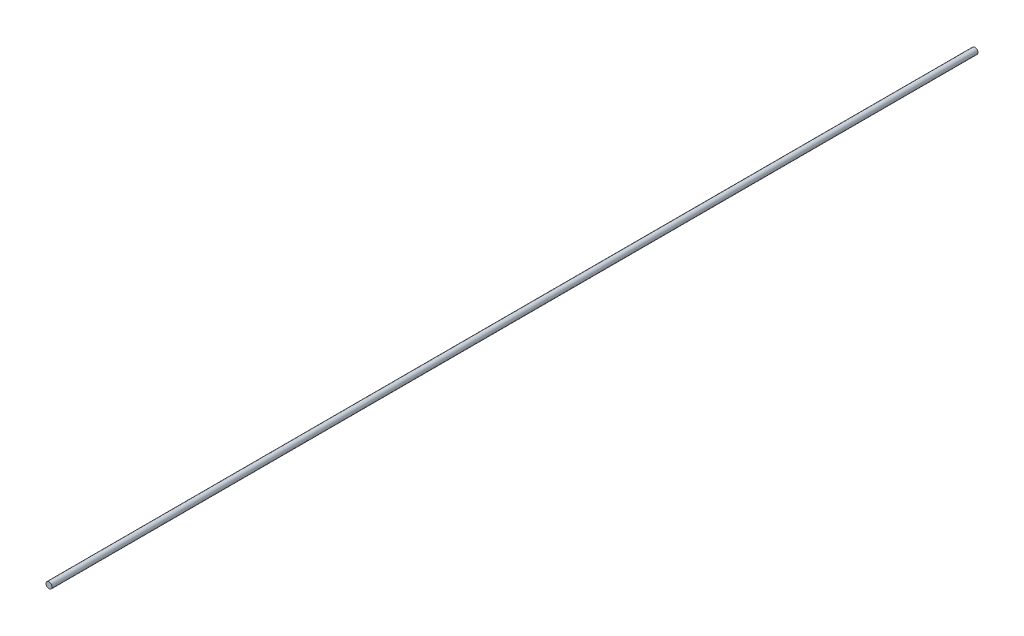
ISO-10303-21;
HEADER;
FILE_DESCRIPTION(('STEP AP214'),'2;1');
FILE_NAME('part.step','',(''),(''),'','','');
FILE_SCHEMA(('AUTOMOTIVE_DESIGN { 1 0 10303 214 1 1 1 1 }'));
ENDSEC;
DATA;
#1=APPLICATION_CONTEXT('core data for automotive mechanical design processes');
#2=APPLICATION_PROTOCOL_DEFINITION('international standard','automotive_design',2000,#1);
#3=PRODUCT_CONTEXT('',#1,'mechanical');
#4=PRODUCT('Part','Part','',(#3));
#5=PRODUCT_RELATED_PRODUCT_CATEGORY('part','',(#4));
#6=PRODUCT_DEFINITION_FORMATION('','',#4);
#7=PRODUCT_DEFINITION_CONTEXT('part definition',#1,'design');
#8=PRODUCT_DEFINITION('design','',#6,#7);
#9=PRODUCT_DEFINITION_SHAPE('','',#8);
#10=(LENGTH_UNIT() NAMED_UNIT(*) SI_UNIT(.MILLI.,.METRE.));
#11=(NAMED_UNIT(*) PLANE_ANGLE_UNIT() SI_UNIT($,.RADIAN.));
#12=(NAMED_UNIT(*) SI_UNIT($,.STERADIAN.) SOLID_ANGLE_UNIT());
#13=UNCERTAINTY_MEASURE_WITH_UNIT(LENGTH_MEASURE(1.E-05),#10,'distance_accuracy_value','');
#14=(GEOMETRIC_REPRESENTATION_CONTEXT(3) GLOBAL_UNCERTAINTY_ASSIGNED_CONTEXT((#13)) GLOBAL_UNIT_ASSIGNED_CONTEXT((#10,
#11,#12)) REPRESENTATION_CONTEXT('',''));
#15=CARTESIAN_POINT('',(0.,0.,0.));
#16=DIRECTION('',(0.,0.,1.));
#17=DIRECTION('',(1.,0.,0.));
#18=AXIS2_PLACEMENT_3D('',#15,#16,#17);
#19=CARTESIAN_POINT('',(0.,0.,610.));
#20=DIRECTION('',(0.,0.,-1.));
#21=DIRECTION('',(-1.,0.,0.));
#22=AXIS2_PLACEMENT_3D('',#19,#20,#21);
#23=CYLINDRICAL_SURFACE('',#22,2.);
#24=CARTESIAN_POINT('',(0.,0.,610.));
#25=DIRECTION('',(0.,0.,1.));
#26=DIRECTION('',(1.,0.,0.));
#27=AXIS2_PLACEMENT_3D('',#24,#25,#26);
#28=CIRCLE('',#27,2.);
#29=CARTESIAN_POINT('',(2.,0.,610.));
#30=VERTEX_POINT('',#29);
#31=EDGE_CURVE('E10',#30,#30,#28,.T.);
#32=ORIENTED_EDGE('',*,*,#31,.F.);
#33=EDGE_LOOP('',(#32));
#34=FACE_BOUND('',#33,.T.);
#35=CARTESIAN_POINT('',(0.,0.,0.));
#36=DIRECTION('',(0.,0.,1.));
#37=DIRECTION('',(1.,0.,0.));
#38=AXIS2_PLACEMENT_3D('',#35,#36,#37);
#39=CIRCLE('',#38,2.);
#40=CARTESIAN_POINT('',(2.,0.,0.));
#41=VERTEX_POINT('',#40);
#42=EDGE_CURVE('E38',#41,#41,#39,.T.);
#43=ORIENTED_EDGE('',*,*,#42,.T.);
#44=EDGE_LOOP('',(#43));
#45=FACE_BOUND('',#44,.T.);
#46=ADVANCED_FACE('F35',(#34,#45),#23,.T.);
#47=CARTESIAN_POINT('',(0.,0.,610.));
#48=DIRECTION('',(0.,0.,1.));
#49=DIRECTION('',(1.,0.,0.));
#50=AXIS2_PLACEMENT_3D('',#47,#48,#49);
#51=PLANE('',#50);
#52=ORIENTED_EDGE('',*,*,#31,.T.);
#53=EDGE_LOOP('',(#52));
#54=FACE_BOUND('',#53,.T.);
#55=ADVANCED_FACE('F50',(#54),#51,.T.);
#56=CARTESIAN_POINT('',(0.,0.,0.));
#57=DIRECTION('',(0.,0.,1.));
#58=DIRECTION('',(1.,0.,0.));
#59=AXIS2_PLACEMENT_3D('',#56,#57,#58);
#60=PLANE('',#59);
#61=ORIENTED_EDGE('',*,*,#42,.F.);
#62=EDGE_LOOP('',(#61));
#63=FACE_BOUND('',#62,.T.);
#64=ADVANCED_FACE('F48',(#63),#60,.F.);
#65=CLOSED_SHELL('',(#46,#55,#64));
#66=MANIFOLD_SOLID_BREP('B2',#65);
#67=ADVANCED_BREP_SHAPE_REPRESENTATION('',(#18,#66),#14);
#68=SHAPE_DEFINITION_REPRESENTATION(#9,#67);
ENDSEC;
END-ISO-10303-21;
